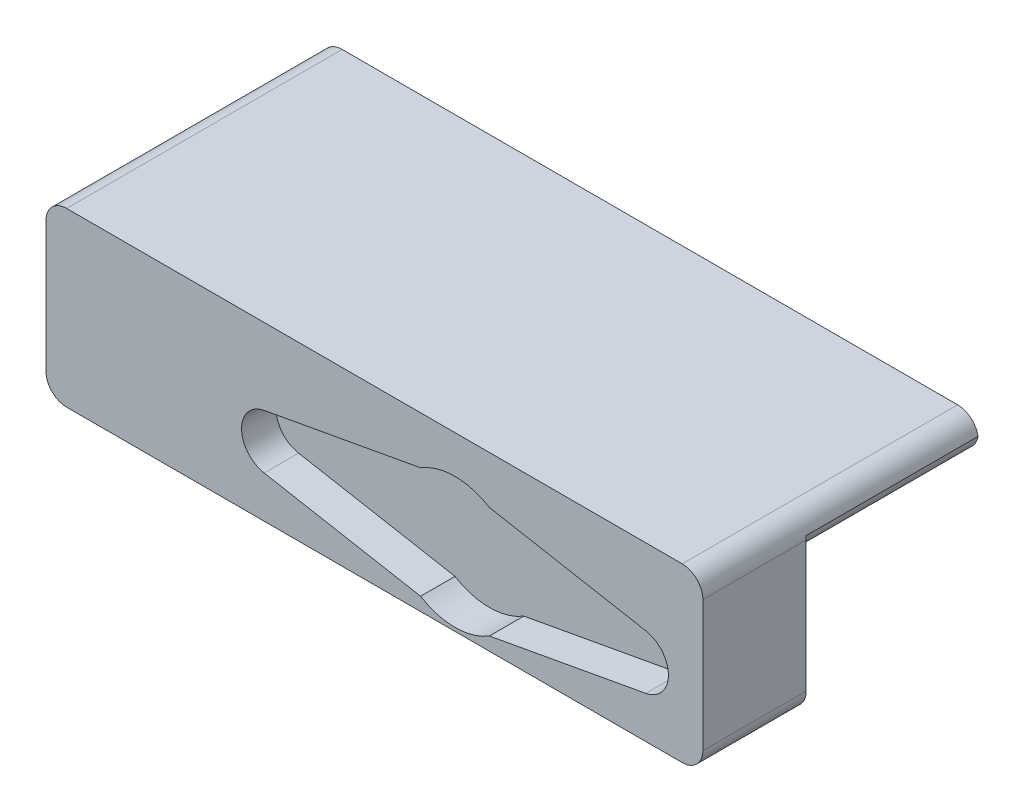
ISO-10303-21;
HEADER;
FILE_DESCRIPTION(('STEP AP214'),'2;1');
FILE_NAME('part.step','',(''),(''),'','','');
FILE_SCHEMA(('AUTOMOTIVE_DESIGN { 1 0 10303 214 1 1 1 1 }'));
ENDSEC;
DATA;
#1=APPLICATION_CONTEXT('core data for automotive mechanical design processes');
#2=APPLICATION_PROTOCOL_DEFINITION('international standard','automotive_design',2000,#1);
#3=PRODUCT_CONTEXT('',#1,'mechanical');
#4=PRODUCT('Part','Part','',(#3));
#5=PRODUCT_RELATED_PRODUCT_CATEGORY('part','',(#4));
#6=PRODUCT_DEFINITION_FORMATION('','',#4);
#7=PRODUCT_DEFINITION_CONTEXT('part definition',#1,'design');
#8=PRODUCT_DEFINITION('design','',#6,#7);
#9=PRODUCT_DEFINITION_SHAPE('','',#8);
#10=(LENGTH_UNIT() NAMED_UNIT(*) SI_UNIT(.MILLI.,.METRE.));
#11=(NAMED_UNIT(*) PLANE_ANGLE_UNIT() SI_UNIT($,.RADIAN.));
#12=(NAMED_UNIT(*) SI_UNIT($,.STERADIAN.) SOLID_ANGLE_UNIT());
#13=UNCERTAINTY_MEASURE_WITH_UNIT(LENGTH_MEASURE(1.E-05),#10,'distance_accuracy_value','');
#14=(GEOMETRIC_REPRESENTATION_CONTEXT(3) GLOBAL_UNCERTAINTY_ASSIGNED_CONTEXT((#13)) GLOBAL_UNIT_ASSIGNED_CONTEXT((#10,
#11,#12)) REPRESENTATION_CONTEXT('',''));
#15=CARTESIAN_POINT('',(0.,0.,0.));
#16=DIRECTION('',(0.,0.,1.));
#17=DIRECTION('',(1.,0.,0.));
#18=AXIS2_PLACEMENT_3D('',#15,#16,#17);
#19=CARTESIAN_POINT('',(-37.719,-6.35,6.35));
#20=DIRECTION('',(1.,0.,0.));
#21=DIRECTION('',(0.,0.,-1.));
#22=AXIS2_PLACEMENT_3D('',#19,#20,#21);
#23=PLANE('',#22);
#24=DIRECTION('',(0.,-1.,0.));
#25=VECTOR('',#24,1.);
#26=CARTESIAN_POINT('',(-37.719,-6.35,6.35));
#27=LINE('',#26,#25);
#28=CARTESIAN_POINT('',(-37.719,7.62,6.35));
#29=VERTEX_POINT('',#28);
#30=CARTESIAN_POINT('',(-37.719,-4.445,6.35));
#31=VERTEX_POINT('',#30);
#32=EDGE_CURVE('E253',#29,#31,#27,.T.);
#33=ORIENTED_EDGE('',*,*,#32,.F.);
#34=DIRECTION('',(0.,0.,1.));
#35=VECTOR('',#34,1.);
#36=CARTESIAN_POINT('',(-37.719,7.62,6.35));
#37=LINE('',#36,#35);
#38=CARTESIAN_POINT('',(-37.719,7.62,-19.05));
#39=VERTEX_POINT('',#38);
#40=EDGE_CURVE('E285',#29,#39,#37,.F.);
#41=ORIENTED_EDGE('',*,*,#40,.T.);
#42=DIRECTION('',(0.,1.,0.));
#43=VECTOR('',#42,1.);
#44=CARTESIAN_POINT('',(-37.719,-6.34999999999999,-19.05));
#45=LINE('',#44,#43);
#46=CARTESIAN_POINT('',(-37.719,-4.445,-19.05));
#47=VERTEX_POINT('',#46);
#48=EDGE_CURVE('E378',#47,#39,#45,.T.);
#49=ORIENTED_EDGE('',*,*,#48,.F.);
#50=DIRECTION('',(0.,0.,-1.));
#51=VECTOR('',#50,1.);
#52=CARTESIAN_POINT('',(-37.719,-4.445,6.35));
#53=LINE('',#52,#51);
#54=EDGE_CURVE('E283',#47,#31,#53,.F.);
#55=ORIENTED_EDGE('',*,*,#54,.T.);
#56=EDGE_LOOP('',(#33,#41,#49,#55));
#57=FACE_BOUND('',#56,.T.);
#58=ADVANCED_FACE('F38',(#57),#23,.F.);
#59=CARTESIAN_POINT('',(-37.719,-6.35,6.35));
#60=DIRECTION('',(0.,1.,0.));
#61=DIRECTION('',(0.,0.,1.));
#62=AXIS2_PLACEMENT_3D('',#59,#60,#61);
#63=PLANE('',#62);
#64=DIRECTION('',(1.,0.,0.));
#65=VECTOR('',#64,1.);
#66=CARTESIAN_POINT('',(-37.719,-6.35,6.35));
#67=LINE('',#66,#65);
#68=CARTESIAN_POINT('',(-35.814,-6.35,6.35));
#69=VERTEX_POINT('',#68);
#70=CARTESIAN_POINT('',(20.955,-6.35,6.35));
#71=VERTEX_POINT('',#70);
#72=EDGE_CURVE('E267',#69,#71,#67,.T.);
#73=ORIENTED_EDGE('',*,*,#72,.F.);
#74=DIRECTION('',(0.,0.,-1.));
#75=VECTOR('',#74,1.);
#76=CARTESIAN_POINT('',(-35.814,-6.35,6.35));
#77=LINE('',#76,#75);
#78=CARTESIAN_POINT('',(-35.814,-6.34999999999999,-3.175));
#79=VERTEX_POINT('',#78);
#80=EDGE_CURVE('E314',#69,#79,#77,.T.);
#81=ORIENTED_EDGE('',*,*,#80,.T.);
#82=DIRECTION('',(-1.,0.,0.));
#83=VECTOR('',#82,1.);
#84=CARTESIAN_POINT('',(-34.544,-6.34999999999999,-3.175));
#85=LINE('',#84,#83);
#86=CARTESIAN_POINT('',(20.955,-6.34999999999999,-3.175));
#87=VERTEX_POINT('',#86);
#88=EDGE_CURVE('E364',#87,#79,#85,.T.);
#89=ORIENTED_EDGE('',*,*,#88,.F.);
#90=DIRECTION('',(0.,0.,1.));
#91=VECTOR('',#90,1.);
#92=CARTESIAN_POINT('',(20.955,-6.35,6.35));
#93=LINE('',#92,#91);
#94=EDGE_CURVE('E311',#87,#71,#93,.T.);
#95=ORIENTED_EDGE('',*,*,#94,.T.);
#96=EDGE_LOOP('',(#73,#81,#89,#95));
#97=FACE_BOUND('',#96,.T.);
#98=ADVANCED_FACE('F362',(#97),#63,.F.);
#99=CARTESIAN_POINT('',(0.,0.,6.35));
#100=DIRECTION('',(0.,0.,-1.));
#101=DIRECTION('',(-1.,0.,0.));
#102=AXIS2_PLACEMENT_3D('',#99,#100,#101);
#103=PLANE('',#102);
#104=DIRECTION('',(-0.983777025667817,0.179395551138213,0.));
#105=VECTOR('',#104,1.);
#106=CARTESIAN_POINT('',(3.175,5.12936947879562,6.35));
#107=LINE('',#106,#105);
#108=CARTESIAN_POINT('',(17.6006646998911,2.49879364519626,6.35));
#109=VERTEX_POINT('',#108);
#110=CARTESIAN_POINT('',(3.175,5.12936947879562,6.35));
#111=VERTEX_POINT('',#110);
#112=EDGE_CURVE('E235',#109,#111,#107,.T.);
#113=ORIENTED_EDGE('',*,*,#112,.F.);
#114=CARTESIAN_POINT('',(17.145,0.,6.35));
#115=DIRECTION('',(0.,0.,1.));
#116=DIRECTION('',(1.,0.,0.));
#117=AXIS2_PLACEMENT_3D('',#114,#115,#116);
#118=CIRCLE('',#117,2.54);
#119=CARTESIAN_POINT('',(17.6006646998911,-2.49879364519626,6.35));
#120=VERTEX_POINT('',#119);
#121=EDGE_CURVE('E194',#120,#109,#118,.T.);
#122=ORIENTED_EDGE('',*,*,#121,.F.);
#123=DIRECTION('',(0.983777025667817,0.179395551138213,0.));
#124=VECTOR('',#123,1.);
#125=CARTESIAN_POINT('',(3.175,-5.12936947879562,6.35));
#126=LINE('',#125,#124);
#127=CARTESIAN_POINT('',(3.17499999999999,-5.12936947879561,6.35));
#128=VERTEX_POINT('',#127);
#129=EDGE_CURVE('E212',#128,#120,#126,.T.);
#130=ORIENTED_EDGE('',*,*,#129,.F.);
#131=CARTESIAN_POINT('',(0.,0.,6.35));
#132=DIRECTION('',(0.,0.,1.));
#133=DIRECTION('',(1.,0.,0.));
#134=AXIS2_PLACEMENT_3D('',#131,#132,#133);
#135=CIRCLE('',#134,6.03249999999999);
#136=CARTESIAN_POINT('',(-3.17499999999996,-5.12936947879562,6.35));
#137=VERTEX_POINT('',#136);
#138=EDGE_CURVE('E215',#137,#128,#135,.T.);
#139=ORIENTED_EDGE('',*,*,#138,.F.);
#140=DIRECTION('',(0.98377702566782,-0.179395551138198,0.));
#141=VECTOR('',#140,1.);
#142=CARTESIAN_POINT('',(-3.17499999999996,-5.12936947879562,6.35));
#143=LINE('',#142,#141);
#144=CARTESIAN_POINT('',(-17.6006646998911,-2.49879364519659,6.35));
#145=VERTEX_POINT('',#144);
#146=EDGE_CURVE('E246',#145,#137,#143,.T.);
#147=ORIENTED_EDGE('',*,*,#146,.F.);
#148=CARTESIAN_POINT('',(-17.145,-2.22044604925031E-13,6.35));
#149=DIRECTION('',(0.,0.,1.));
#150=DIRECTION('',(-1.,0.,0.));
#151=AXIS2_PLACEMENT_3D('',#148,#149,#150);
#152=CIRCLE('',#151,2.54000000000011);
#153=CARTESIAN_POINT('',(-17.6006646998911,2.49879364519626,6.35));
#154=VERTEX_POINT('',#153);
#155=EDGE_CURVE('E243',#154,#145,#152,.T.);
#156=ORIENTED_EDGE('',*,*,#155,.F.);
#157=DIRECTION('',(-0.983777025667817,-0.179395551138213,0.));
#158=VECTOR('',#157,1.);
#159=CARTESIAN_POINT('',(-3.17500000000003,5.12936947879562,6.35));
#160=LINE('',#159,#158);
#161=CARTESIAN_POINT('',(-3.17500000000003,5.12936947879561,6.35));
#162=VERTEX_POINT('',#161);
#163=EDGE_CURVE('E240',#162,#154,#160,.T.);
#164=ORIENTED_EDGE('',*,*,#163,.F.);
#165=CARTESIAN_POINT('',(0.,0.,6.35));
#166=DIRECTION('',(0.,0.,1.));
#167=DIRECTION('',(1.,0.,0.));
#168=AXIS2_PLACEMENT_3D('',#165,#166,#167);
#169=CIRCLE('',#168,6.03250000000001);
#170=EDGE_CURVE('E237',#111,#162,#169,.T.);
#171=ORIENTED_EDGE('',*,*,#170,.F.);
#172=EDGE_LOOP('',(#113,#122,#130,#139,#147,#156,#164,#171));
#173=FACE_BOUND('',#172,.T.);
#174=DIRECTION('',(1.,0.,0.));
#175=VECTOR('',#174,1.);
#176=CARTESIAN_POINT('',(-37.719,9.525,6.35));
#177=LINE('',#176,#175);
#178=CARTESIAN_POINT('',(-35.814,9.525,6.35));
#179=VERTEX_POINT('',#178);
#180=CARTESIAN_POINT('',(20.955,9.525,6.35));
#181=VERTEX_POINT('',#180);
#182=EDGE_CURVE('E354',#179,#181,#177,.T.);
#183=ORIENTED_EDGE('',*,*,#182,.F.);
#184=CARTESIAN_POINT('',(-35.814,7.62,6.35));
#185=DIRECTION('',(0.,0.,-1.));
#186=DIRECTION('',(-1.,0.,0.));
#187=AXIS2_PLACEMENT_3D('',#184,#185,#186);
#188=CIRCLE('',#187,1.905);
#189=EDGE_CURVE('E281',#179,#29,#188,.F.);
#190=ORIENTED_EDGE('',*,*,#189,.T.);
#191=ORIENTED_EDGE('',*,*,#32,.T.);
#192=CARTESIAN_POINT('',(-35.814,-4.445,6.35));
#193=DIRECTION('',(0.,0.,-1.));
#194=DIRECTION('',(-1.,0.,0.));
#195=AXIS2_PLACEMENT_3D('',#192,#193,#194);
#196=CIRCLE('',#195,1.905);
#197=EDGE_CURVE('E279',#31,#69,#196,.F.);
#198=ORIENTED_EDGE('',*,*,#197,.T.);
#199=ORIENTED_EDGE('',*,*,#72,.T.);
#200=CARTESIAN_POINT('',(20.955,-4.445,6.35));
#201=DIRECTION('',(0.,0.,-1.));
#202=DIRECTION('',(-1.,0.,0.));
#203=AXIS2_PLACEMENT_3D('',#200,#201,#202);
#204=CIRCLE('',#203,1.905);
#205=CARTESIAN_POINT('',(22.86,-4.445,6.35));
#206=VERTEX_POINT('',#205);
#207=EDGE_CURVE('E275',#71,#206,#204,.F.);
#208=ORIENTED_EDGE('',*,*,#207,.T.);
#209=DIRECTION('',(0.,-1.,0.));
#210=VECTOR('',#209,1.);
#211=CARTESIAN_POINT('',(22.86,-6.35,6.35));
#212=LINE('',#211,#210);
#213=CARTESIAN_POINT('',(22.86,7.62,6.35));
#214=VERTEX_POINT('',#213);
#215=EDGE_CURVE('E355',#214,#206,#212,.T.);
#216=ORIENTED_EDGE('',*,*,#215,.F.);
#217=CARTESIAN_POINT('',(20.955,7.62,6.35));
#218=DIRECTION('',(0.,0.,-1.));
#219=DIRECTION('',(-1.,0.,0.));
#220=AXIS2_PLACEMENT_3D('',#217,#218,#219);
#221=CIRCLE('',#220,1.905);
#222=EDGE_CURVE('E277',#214,#181,#221,.F.);
#223=ORIENTED_EDGE('',*,*,#222,.T.);
#224=EDGE_LOOP('',(#183,#190,#191,#198,#199,#208,#216,#223));
#225=FACE_BOUND('',#224,.T.);
#226=ADVANCED_FACE('F367',(#173,#225),#103,.F.);
#227=CARTESIAN_POINT('',(17.145,0.,3.175));
#228=DIRECTION('',(0.,0.,1.));
#229=DIRECTION('',(1.,0.,0.));
#230=AXIS2_PLACEMENT_3D('',#227,#228,#229);
#231=CYLINDRICAL_SURFACE('',#230,2.54);
#232=ORIENTED_EDGE('',*,*,#121,.T.);
#233=DIRECTION('',(0.,0.,1.));
#234=VECTOR('',#233,1.);
#235=CARTESIAN_POINT('',(17.6006646998911,2.49879364519626,3.175));
#236=LINE('',#235,#234);
#237=CARTESIAN_POINT('',(17.6006646998911,2.49879364519626,3.175));
#238=VERTEX_POINT('',#237);
#239=EDGE_CURVE('E187',#238,#109,#236,.T.);
#240=ORIENTED_EDGE('',*,*,#239,.F.);
#241=CARTESIAN_POINT('',(17.145,0.,3.175));
#242=DIRECTION('',(0.,0.,1.));
#243=DIRECTION('',(1.,0.,0.));
#244=AXIS2_PLACEMENT_3D('',#241,#242,#243);
#245=CIRCLE('',#244,2.54);
#246=CARTESIAN_POINT('',(17.6006646998911,-2.49879364519626,3.175));
#247=VERTEX_POINT('',#246);
#248=EDGE_CURVE('E191',#247,#238,#245,.T.);
#249=ORIENTED_EDGE('',*,*,#248,.F.);
#250=DIRECTION('',(0.,0.,1.));
#251=VECTOR('',#250,1.);
#252=CARTESIAN_POINT('',(17.6006646998911,-2.49879364519626,3.175));
#253=LINE('',#252,#251);
#254=EDGE_CURVE('E251',#247,#120,#253,.T.);
#255=ORIENTED_EDGE('',*,*,#254,.T.);
#256=EDGE_LOOP('',(#232,#240,#249,#255));
#257=FACE_BOUND('',#256,.T.);
#258=ADVANCED_FACE('F189',(#257),#231,.F.);
#259=CARTESIAN_POINT('',(3.175,-5.12936947879562,3.175));
#260=DIRECTION('',(0.179395551138213,-0.983777025667817,0.));
#261=DIRECTION('',(0.983777025667817,0.179395551138213,0.));
#262=AXIS2_PLACEMENT_3D('',#259,#260,#261);
#263=PLANE('',#262);
#264=ORIENTED_EDGE('',*,*,#129,.T.);
#265=ORIENTED_EDGE('',*,*,#254,.F.);
#266=DIRECTION('',(0.983777025667817,0.179395551138213,0.));
#267=VECTOR('',#266,1.);
#268=CARTESIAN_POINT('',(3.175,-5.12936947879562,3.175));
#269=LINE('',#268,#267);
#270=CARTESIAN_POINT('',(3.17499999999999,-5.12936947879561,3.175));
#271=VERTEX_POINT('',#270);
#272=EDGE_CURVE('E199',#271,#247,#269,.T.);
#273=ORIENTED_EDGE('',*,*,#272,.F.);
#274=DIRECTION('',(0.,0.,1.));
#275=VECTOR('',#274,1.);
#276=CARTESIAN_POINT('',(3.17499999999999,-5.12936947879561,3.175));
#277=LINE('',#276,#275);
#278=EDGE_CURVE('E254',#271,#128,#277,.T.);
#279=ORIENTED_EDGE('',*,*,#278,.T.);
#280=EDGE_LOOP('',(#264,#265,#273,#279));
#281=FACE_BOUND('',#280,.T.);
#282=ADVANCED_FACE('F454',(#281),#263,.F.);
#283=CARTESIAN_POINT('',(0.,0.,3.175));
#284=DIRECTION('',(0.,0.,1.));
#285=DIRECTION('',(1.,0.,0.));
#286=AXIS2_PLACEMENT_3D('',#283,#284,#285);
#287=CYLINDRICAL_SURFACE('',#286,6.03249999999999);
#288=ORIENTED_EDGE('',*,*,#138,.T.);
#289=ORIENTED_EDGE('',*,*,#278,.F.);
#290=CARTESIAN_POINT('',(0.,0.,3.175));
#291=DIRECTION('',(0.,0.,1.));
#292=DIRECTION('',(1.,0.,0.));
#293=AXIS2_PLACEMENT_3D('',#290,#291,#292);
#294=CIRCLE('',#293,6.03249999999999);
#295=CARTESIAN_POINT('',(-3.17499999999996,-5.12936947879562,3.175));
#296=VERTEX_POINT('',#295);
#297=EDGE_CURVE('E231',#296,#271,#294,.T.);
#298=ORIENTED_EDGE('',*,*,#297,.F.);
#299=DIRECTION('',(0.,0.,1.));
#300=VECTOR('',#299,1.);
#301=CARTESIAN_POINT('',(-3.17499999999996,-5.12936947879562,3.175));
#302=LINE('',#301,#300);
#303=EDGE_CURVE('E256',#296,#137,#302,.T.);
#304=ORIENTED_EDGE('',*,*,#303,.T.);
#305=EDGE_LOOP('',(#288,#289,#298,#304));
#306=FACE_BOUND('',#305,.T.);
#307=ADVANCED_FACE('F457',(#306),#287,.F.);
#308=CARTESIAN_POINT('',(-3.17499999999996,-5.12936947879562,3.175));
#309=DIRECTION('',(-0.179395551138198,-0.98377702566782,0.));
#310=DIRECTION('',(0.98377702566782,-0.179395551138198,0.));
#311=AXIS2_PLACEMENT_3D('',#308,#309,#310);
#312=PLANE('',#311);
#313=ORIENTED_EDGE('',*,*,#146,.T.);
#314=ORIENTED_EDGE('',*,*,#303,.F.);
#315=DIRECTION('',(0.98377702566782,-0.179395551138198,0.));
#316=VECTOR('',#315,1.);
#317=CARTESIAN_POINT('',(-3.17499999999996,-5.12936947879562,3.175));
#318=LINE('',#317,#316);
#319=CARTESIAN_POINT('',(-17.6006646998911,-2.49879364519659,3.175));
#320=VERTEX_POINT('',#319);
#321=EDGE_CURVE('E228',#320,#296,#318,.T.);
#322=ORIENTED_EDGE('',*,*,#321,.F.);
#323=DIRECTION('',(0.,0.,1.));
#324=VECTOR('',#323,1.);
#325=CARTESIAN_POINT('',(-17.6006646998911,-2.49879364519659,3.175));
#326=LINE('',#325,#324);
#327=EDGE_CURVE('E258',#320,#145,#326,.T.);
#328=ORIENTED_EDGE('',*,*,#327,.T.);
#329=EDGE_LOOP('',(#313,#314,#322,#328));
#330=FACE_BOUND('',#329,.T.);
#331=ADVANCED_FACE('F461',(#330),#312,.F.);
#332=CARTESIAN_POINT('',(-17.145,-2.22044604925031E-13,3.175));
#333=DIRECTION('',(0.,0.,1.));
#334=DIRECTION('',(1.,0.,0.));
#335=AXIS2_PLACEMENT_3D('',#332,#333,#334);
#336=CYLINDRICAL_SURFACE('',#335,2.54000000000011);
#337=ORIENTED_EDGE('',*,*,#155,.T.);
#338=ORIENTED_EDGE('',*,*,#327,.F.);
#339=CARTESIAN_POINT('',(-17.145,-2.22044604925031E-13,3.175));
#340=DIRECTION('',(0.,0.,1.));
#341=DIRECTION('',(-1.,0.,0.));
#342=AXIS2_PLACEMENT_3D('',#339,#340,#341);
#343=CIRCLE('',#342,2.54000000000011);
#344=CARTESIAN_POINT('',(-17.6006646998911,2.49879364519626,3.175));
#345=VERTEX_POINT('',#344);
#346=EDGE_CURVE('E225',#345,#320,#343,.T.);
#347=ORIENTED_EDGE('',*,*,#346,.F.);
#348=DIRECTION('',(0.,0.,1.));
#349=VECTOR('',#348,1.);
#350=CARTESIAN_POINT('',(-17.6006646998911,2.49879364519626,3.175));
#351=LINE('',#350,#349);
#352=EDGE_CURVE('E260',#345,#154,#351,.T.);
#353=ORIENTED_EDGE('',*,*,#352,.T.);
#354=EDGE_LOOP('',(#337,#338,#347,#353));
#355=FACE_BOUND('',#354,.T.);
#356=ADVANCED_FACE('F465',(#355),#336,.F.);
#357=CARTESIAN_POINT('',(-3.17500000000003,5.12936947879562,3.175));
#358=DIRECTION('',(-0.179395551138213,0.983777025667817,0.));
#359=DIRECTION('',(-0.983777025667817,-0.179395551138213,0.));
#360=AXIS2_PLACEMENT_3D('',#357,#358,#359);
#361=PLANE('',#360);
#362=ORIENTED_EDGE('',*,*,#163,.T.);
#363=ORIENTED_EDGE('',*,*,#352,.F.);
#364=DIRECTION('',(-0.983777025667817,-0.179395551138213,0.));
#365=VECTOR('',#364,1.);
#366=CARTESIAN_POINT('',(-3.17500000000003,5.12936947879562,3.175));
#367=LINE('',#366,#365);
#368=CARTESIAN_POINT('',(-3.17500000000003,5.12936947879561,3.175));
#369=VERTEX_POINT('',#368);
#370=EDGE_CURVE('E222',#369,#345,#367,.T.);
#371=ORIENTED_EDGE('',*,*,#370,.F.);
#372=DIRECTION('',(0.,0.,1.));
#373=VECTOR('',#372,1.);
#374=CARTESIAN_POINT('',(-3.17500000000003,5.12936947879561,3.175));
#375=LINE('',#374,#373);
#376=EDGE_CURVE('E262',#369,#162,#375,.T.);
#377=ORIENTED_EDGE('',*,*,#376,.T.);
#378=EDGE_LOOP('',(#362,#363,#371,#377));
#379=FACE_BOUND('',#378,.T.);
#380=ADVANCED_FACE('F469',(#379),#361,.F.);
#381=CARTESIAN_POINT('',(0.,0.,3.175));
#382=DIRECTION('',(0.,0.,1.));
#383=DIRECTION('',(1.,0.,0.));
#384=AXIS2_PLACEMENT_3D('',#381,#382,#383);
#385=CYLINDRICAL_SURFACE('',#384,6.03250000000001);
#386=ORIENTED_EDGE('',*,*,#170,.T.);
#387=ORIENTED_EDGE('',*,*,#376,.F.);
#388=CARTESIAN_POINT('',(0.,0.,3.175));
#389=DIRECTION('',(0.,0.,1.));
#390=DIRECTION('',(1.,0.,0.));
#391=AXIS2_PLACEMENT_3D('',#388,#389,#390);
#392=CIRCLE('',#391,6.03250000000001);
#393=CARTESIAN_POINT('',(3.175,5.12936947879562,3.175));
#394=VERTEX_POINT('',#393);
#395=EDGE_CURVE('E207',#394,#369,#392,.T.);
#396=ORIENTED_EDGE('',*,*,#395,.F.);
#397=DIRECTION('',(0.,0.,1.));
#398=VECTOR('',#397,1.);
#399=CARTESIAN_POINT('',(3.175,5.12936947879562,3.175));
#400=LINE('',#399,#398);
#401=EDGE_CURVE('E198',#394,#111,#400,.T.);
#402=ORIENTED_EDGE('',*,*,#401,.T.);
#403=EDGE_LOOP('',(#386,#387,#396,#402));
#404=FACE_BOUND('',#403,.T.);
#405=ADVANCED_FACE('F473',(#404),#385,.F.);
#406=CARTESIAN_POINT('',(3.175,5.12936947879562,3.175));
#407=DIRECTION('',(0.179395551138213,0.983777025667817,0.));
#408=DIRECTION('',(-0.983777025667817,0.179395551138213,0.));
#409=AXIS2_PLACEMENT_3D('',#406,#407,#408);
#410=PLANE('',#409);
#411=ORIENTED_EDGE('',*,*,#112,.T.);
#412=ORIENTED_EDGE('',*,*,#401,.F.);
#413=DIRECTION('',(-0.983777025667817,0.179395551138213,0.));
#414=VECTOR('',#413,1.);
#415=CARTESIAN_POINT('',(3.175,5.12936947879562,3.175));
#416=LINE('',#415,#414);
#417=EDGE_CURVE('E202',#238,#394,#416,.T.);
#418=ORIENTED_EDGE('',*,*,#417,.F.);
#419=ORIENTED_EDGE('',*,*,#239,.T.);
#420=EDGE_LOOP('',(#411,#412,#418,#419));
#421=FACE_BOUND('',#420,.T.);
#422=ADVANCED_FACE('F203',(#421),#410,.F.);
#423=CARTESIAN_POINT('',(17.145,0.,3.175));
#424=DIRECTION('',(0.,0.,1.));
#425=DIRECTION('',(1.,0.,0.));
#426=AXIS2_PLACEMENT_3D('',#423,#424,#425);
#427=PLANE('',#426);
#428=ORIENTED_EDGE('',*,*,#248,.T.);
#429=ORIENTED_EDGE('',*,*,#417,.T.);
#430=ORIENTED_EDGE('',*,*,#395,.T.);
#431=ORIENTED_EDGE('',*,*,#370,.T.);
#432=ORIENTED_EDGE('',*,*,#346,.T.);
#433=ORIENTED_EDGE('',*,*,#321,.T.);
#434=ORIENTED_EDGE('',*,*,#297,.T.);
#435=ORIENTED_EDGE('',*,*,#272,.T.);
#436=EDGE_LOOP('',(#428,#429,#430,#431,#432,#433,#434,#435));
#437=FACE_BOUND('',#436,.T.);
#438=ADVANCED_FACE('F209',(#437),#427,.T.);
#439=CARTESIAN_POINT('',(-34.544,84.1561330744563,-3.175));
#440=DIRECTION('',(1.,0.,0.));
#441=DIRECTION('',(0.,0.,-1.));
#442=AXIS2_PLACEMENT_3D('',#439,#440,#441);
#443=PLANE('',#442);
#444=DIRECTION('',(0.,-1.,0.));
#445=VECTOR('',#444,1.);
#446=CARTESIAN_POINT('',(-34.544,6.35,-19.05));
#447=LINE('',#446,#445);
#448=CARTESIAN_POINT('',(-34.544,4.445,-19.05));
#449=VERTEX_POINT('',#448);
#450=CARTESIAN_POINT('',(-34.544,-4.445,-19.05));
#451=VERTEX_POINT('',#450);
#452=EDGE_CURVE('E333',#449,#451,#447,.T.);
#453=ORIENTED_EDGE('',*,*,#452,.F.);
#454=DIRECTION('',(0.,0.,-1.));
#455=VECTOR('',#454,1.);
#456=CARTESIAN_POINT('',(-34.544,4.445,-3.175));
#457=LINE('',#456,#455);
#458=CARTESIAN_POINT('',(-34.544,4.44500000000003,-3.175));
#459=VERTEX_POINT('',#458);
#460=EDGE_CURVE('E305',#449,#459,#457,.F.);
#461=ORIENTED_EDGE('',*,*,#460,.T.);
#462=DIRECTION('',(0.,-1.,0.));
#463=VECTOR('',#462,1.);
#464=CARTESIAN_POINT('',(-34.544,84.1561330744563,-3.175));
#465=LINE('',#464,#463);
#466=CARTESIAN_POINT('',(-34.544,-4.445,-3.175));
#467=VERTEX_POINT('',#466);
#468=EDGE_CURVE('E391',#459,#467,#465,.T.);
#469=ORIENTED_EDGE('',*,*,#468,.T.);
#470=DIRECTION('',(0.,0.,-1.));
#471=VECTOR('',#470,1.);
#472=CARTESIAN_POINT('',(-34.544,-4.445,-19.05));
#473=LINE('',#472,#471);
#474=EDGE_CURVE('E303',#467,#451,#473,.T.);
#475=ORIENTED_EDGE('',*,*,#474,.T.);
#476=EDGE_LOOP('',(#453,#461,#469,#475));
#477=FACE_BOUND('',#476,.T.);
#478=ADVANCED_FACE('F407',(#477),#443,.T.);
#479=CARTESIAN_POINT('',(-34.544,84.1561330744563,-3.175));
#480=DIRECTION('',(0.,0.,-1.));
#481=DIRECTION('',(-1.,0.,0.));
#482=AXIS2_PLACEMENT_3D('',#479,#480,#481);
#483=PLANE('',#482);
#484=ORIENTED_EDGE('',*,*,#468,.F.);
#485=CARTESIAN_POINT('',(-32.639,4.445,-3.175));
#486=DIRECTION('',(0.,0.,-1.));
#487=DIRECTION('',(-1.,0.,0.));
#488=AXIS2_PLACEMENT_3D('',#485,#486,#487);
#489=CIRCLE('',#488,1.905);
#490=CARTESIAN_POINT('',(-32.639,6.34999999999999,-3.175));
#491=VERTEX_POINT('',#490);
#492=EDGE_CURVE('E309',#459,#491,#489,.T.);
#493=ORIENTED_EDGE('',*,*,#492,.T.);
#494=DIRECTION('',(-1.,0.,0.));
#495=VECTOR('',#494,1.);
#496=CARTESIAN_POINT('',(-34.544,6.34999999999999,-3.175));
#497=LINE('',#496,#495);
#498=CARTESIAN_POINT('',(20.955,6.34999999999999,-3.175));
#499=VERTEX_POINT('',#498);
#500=EDGE_CURVE('E218',#499,#491,#497,.T.);
#501=ORIENTED_EDGE('',*,*,#500,.F.);
#502=CARTESIAN_POINT('',(20.955,8.255,-3.175));
#503=DIRECTION('',(0.,0.,-1.));
#504=DIRECTION('',(-1.,0.,0.));
#505=AXIS2_PLACEMENT_3D('',#502,#503,#504);
#506=CIRCLE('',#505,1.905);
#507=CARTESIAN_POINT('',(22.8333553311341,7.9375,-3.175));
#508=VERTEX_POINT('',#507);
#509=EDGE_CURVE('E47',#499,#508,#506,.F.);
#510=ORIENTED_EDGE('',*,*,#509,.T.);
#511=CARTESIAN_POINT('',(20.955,7.62,-3.175));
#512=DIRECTION('',(0.,0.,-1.));
#513=DIRECTION('',(-1.,0.,0.));
#514=AXIS2_PLACEMENT_3D('',#511,#512,#513);
#515=CIRCLE('',#514,1.905);
#516=CARTESIAN_POINT('',(22.86,7.62,-3.175));
#517=VERTEX_POINT('',#516);
#518=EDGE_CURVE('E11',#508,#517,#515,.T.);
#519=ORIENTED_EDGE('',*,*,#518,.T.);
#520=DIRECTION('',(0.,1.,0.));
#521=VECTOR('',#520,1.);
#522=CARTESIAN_POINT('',(22.86,84.1561330744563,-3.175));
#523=LINE('',#522,#521);
#524=CARTESIAN_POINT('',(22.86,-4.445,-3.175));
#525=VERTEX_POINT('',#524);
#526=EDGE_CURVE('E350',#525,#517,#523,.T.);
#527=ORIENTED_EDGE('',*,*,#526,.F.);
#528=CARTESIAN_POINT('',(20.955,-4.445,-3.175));
#529=DIRECTION('',(0.,0.,-1.));
#530=DIRECTION('',(-1.,0.,0.));
#531=AXIS2_PLACEMENT_3D('',#528,#529,#530);
#532=CIRCLE('',#531,1.905);
#533=EDGE_CURVE('E307',#525,#87,#532,.T.);
#534=ORIENTED_EDGE('',*,*,#533,.T.);
#535=ORIENTED_EDGE('',*,*,#88,.T.);
#536=CARTESIAN_POINT('',(-35.814,-4.445,-3.175));
#537=DIRECTION('',(0.,0.,-1.));
#538=DIRECTION('',(-1.,0.,0.));
#539=AXIS2_PLACEMENT_3D('',#536,#537,#538);
#540=CIRCLE('',#539,1.905);
#541=CARTESIAN_POINT('',(-36.1315,-6.32335533113413,-3.175));
#542=VERTEX_POINT('',#541);
#543=EDGE_CURVE('E60',#79,#542,#540,.T.);
#544=ORIENTED_EDGE('',*,*,#543,.T.);
#545=CARTESIAN_POINT('',(-36.449,-4.445,-3.175));
#546=DIRECTION('',(0.,0.,-1.));
#547=DIRECTION('',(-1.,0.,0.));
#548=AXIS2_PLACEMENT_3D('',#545,#546,#547);
#549=CIRCLE('',#548,1.905);
#550=EDGE_CURVE('E324',#542,#467,#549,.F.);
#551=ORIENTED_EDGE('',*,*,#550,.T.);
#552=EDGE_LOOP('',(#484,#493,#501,#510,#519,#527,#534,#535,#544,#551));
#553=FACE_BOUND('',#552,.T.);
#554=ADVANCED_FACE('F349',(#553),#483,.T.);
#555=CARTESIAN_POINT('',(0.,6.35,0.));
#556=DIRECTION('',(0.,-1.,0.));
#557=DIRECTION('',(0.,0.,-1.));
#558=AXIS2_PLACEMENT_3D('',#555,#556,#557);
#559=PLANE('',#558);
#560=ORIENTED_EDGE('',*,*,#500,.T.);
#561=DIRECTION('',(0.,0.,-1.));
#562=VECTOR('',#561,1.);
#563=CARTESIAN_POINT('',(-32.639,6.35,-19.05));
#564=LINE('',#563,#562);
#565=CARTESIAN_POINT('',(-32.639,6.35,-19.05));
#566=VERTEX_POINT('',#565);
#567=EDGE_CURVE('E300',#491,#566,#564,.T.);
#568=ORIENTED_EDGE('',*,*,#567,.T.);
#569=DIRECTION('',(-1.,0.,0.));
#570=VECTOR('',#569,1.);
#571=CARTESIAN_POINT('',(22.86,6.35,-19.05));
#572=LINE('',#571,#570);
#573=CARTESIAN_POINT('',(20.955,6.35,-19.05));
#574=VERTEX_POINT('',#573);
#575=EDGE_CURVE('E328',#574,#566,#572,.T.);
#576=ORIENTED_EDGE('',*,*,#575,.F.);
#577=DIRECTION('',(0.,0.,-1.));
#578=VECTOR('',#577,1.);
#579=CARTESIAN_POINT('',(20.955,6.35,-3.175));
#580=LINE('',#579,#578);
#581=EDGE_CURVE('E297',#574,#499,#580,.F.);
#582=ORIENTED_EDGE('',*,*,#581,.T.);
#583=EDGE_LOOP('',(#560,#568,#576,#582));
#584=FACE_BOUND('',#583,.T.);
#585=ADVANCED_FACE('F398',(#584),#559,.T.);
#586=CARTESIAN_POINT('',(0.,9.525,0.));
#587=DIRECTION('',(0.,-1.,0.));
#588=DIRECTION('',(0.,0.,-1.));
#589=AXIS2_PLACEMENT_3D('',#586,#587,#588);
#590=PLANE('',#589);
#591=DIRECTION('',(1.,0.,0.));
#592=VECTOR('',#591,1.);
#593=CARTESIAN_POINT('',(-37.719,9.52500000000001,-19.05));
#594=LINE('',#593,#592);
#595=CARTESIAN_POINT('',(-35.814,9.52500000000001,-19.05));
#596=VERTEX_POINT('',#595);
#597=CARTESIAN_POINT('',(20.955,9.525,-19.05));
#598=VERTEX_POINT('',#597);
#599=EDGE_CURVE('E381',#596,#598,#594,.T.);
#600=ORIENTED_EDGE('',*,*,#599,.F.);
#601=DIRECTION('',(0.,0.,1.));
#602=VECTOR('',#601,1.);
#603=CARTESIAN_POINT('',(-35.814,9.525,0.));
#604=LINE('',#603,#602);
#605=EDGE_CURVE('E272',#596,#179,#604,.T.);
#606=ORIENTED_EDGE('',*,*,#605,.T.);
#607=ORIENTED_EDGE('',*,*,#182,.T.);
#608=DIRECTION('',(0.,0.,1.));
#609=VECTOR('',#608,1.);
#610=CARTESIAN_POINT('',(20.955,9.525,0.));
#611=LINE('',#610,#609);
#612=EDGE_CURVE('E270',#181,#598,#611,.F.);
#613=ORIENTED_EDGE('',*,*,#612,.T.);
#614=EDGE_LOOP('',(#600,#606,#607,#613));
#615=FACE_BOUND('',#614,.T.);
#616=ADVANCED_FACE('F439',(#615),#590,.F.);
#617=CARTESIAN_POINT('',(22.86,-6.35,-19.05));
#618=DIRECTION('',(-1.,0.,0.));
#619=DIRECTION('',(0.,-1.,0.));
#620=AXIS2_PLACEMENT_3D('',#617,#618,#619);
#621=PLANE('',#620);
#622=ORIENTED_EDGE('',*,*,#526,.T.);
#623=DIRECTION('',(0.,0.,1.));
#624=VECTOR('',#623,1.);
#625=CARTESIAN_POINT('',(22.86,7.62,-19.05));
#626=LINE('',#625,#624);
#627=EDGE_CURVE('E319',#517,#214,#626,.T.);
#628=ORIENTED_EDGE('',*,*,#627,.T.);
#629=ORIENTED_EDGE('',*,*,#215,.T.);
#630=DIRECTION('',(0.,0.,1.));
#631=VECTOR('',#630,1.);
#632=CARTESIAN_POINT('',(22.86,-4.445,-19.05));
#633=LINE('',#632,#631);
#634=EDGE_CURVE('E317',#206,#525,#633,.F.);
#635=ORIENTED_EDGE('',*,*,#634,.T.);
#636=EDGE_LOOP('',(#622,#628,#629,#635));
#637=FACE_BOUND('',#636,.T.);
#638=ADVANCED_FACE('F434',(#637),#621,.F.);
#639=CARTESIAN_POINT('',(0.,0.,-19.05));
#640=DIRECTION('',(0.,0.,1.));
#641=DIRECTION('',(1.,0.,0.));
#642=AXIS2_PLACEMENT_3D('',#639,#640,#641);
#643=PLANE('',#642);
#644=ORIENTED_EDGE('',*,*,#48,.T.);
#645=CARTESIAN_POINT('',(-35.814,7.62,-19.05));
#646=DIRECTION('',(0.,0.,1.));
#647=DIRECTION('',(1.,0.,0.));
#648=AXIS2_PLACEMENT_3D('',#645,#646,#647);
#649=CIRCLE('',#648,1.905);
#650=EDGE_CURVE('E295',#39,#596,#649,.F.);
#651=ORIENTED_EDGE('',*,*,#650,.T.);
#652=ORIENTED_EDGE('',*,*,#599,.T.);
#653=CARTESIAN_POINT('',(20.955,7.62,-19.05));
#654=DIRECTION('',(0.,0.,1.));
#655=DIRECTION('',(1.,0.,0.));
#656=AXIS2_PLACEMENT_3D('',#653,#654,#655);
#657=CIRCLE('',#656,1.905);
#658=CARTESIAN_POINT('',(22.8333553311341,7.9375,-19.05));
#659=VERTEX_POINT('',#658);
#660=EDGE_CURVE('E287',#598,#659,#657,.F.);
#661=ORIENTED_EDGE('',*,*,#660,.T.);
#662=CARTESIAN_POINT('',(20.955,8.255,-19.05));
#663=DIRECTION('',(0.,0.,1.));
#664=DIRECTION('',(1.,0.,0.));
#665=AXIS2_PLACEMENT_3D('',#662,#663,#664);
#666=CIRCLE('',#665,1.905);
#667=EDGE_CURVE('E289',#659,#574,#666,.F.);
#668=ORIENTED_EDGE('',*,*,#667,.T.);
#669=ORIENTED_EDGE('',*,*,#575,.T.);
#670=CARTESIAN_POINT('',(-32.639,4.445,-19.05));
#671=DIRECTION('',(0.,0.,1.));
#672=DIRECTION('',(1.,0.,0.));
#673=AXIS2_PLACEMENT_3D('',#670,#671,#672);
#674=CIRCLE('',#673,1.905);
#675=EDGE_CURVE('E321',#566,#449,#674,.T.);
#676=ORIENTED_EDGE('',*,*,#675,.T.);
#677=ORIENTED_EDGE('',*,*,#452,.T.);
#678=CARTESIAN_POINT('',(-36.449,-4.445,-19.05));
#679=DIRECTION('',(0.,0.,1.));
#680=DIRECTION('',(1.,0.,0.));
#681=AXIS2_PLACEMENT_3D('',#678,#679,#680);
#682=CIRCLE('',#681,1.905);
#683=CARTESIAN_POINT('',(-36.1315,-6.32335533113413,-19.05));
#684=VERTEX_POINT('',#683);
#685=EDGE_CURVE('E291',#451,#684,#682,.F.);
#686=ORIENTED_EDGE('',*,*,#685,.T.);
#687=CARTESIAN_POINT('',(-35.814,-4.445,-19.05));
#688=DIRECTION('',(0.,0.,1.));
#689=DIRECTION('',(1.,0.,0.));
#690=AXIS2_PLACEMENT_3D('',#687,#688,#689);
#691=CIRCLE('',#690,1.905);
#692=EDGE_CURVE('E293',#684,#47,#691,.F.);
#693=ORIENTED_EDGE('',*,*,#692,.T.);
#694=EDGE_LOOP('',(#644,#651,#652,#661,#668,#669,#676,#677,#686,#693));
#695=FACE_BOUND('',#694,.T.);
#696=ADVANCED_FACE('F405',(#695),#643,.F.);
#697=CARTESIAN_POINT('',(-35.814,7.62,0.));
#698=DIRECTION('',(0.,0.,1.));
#699=DIRECTION('',(1.,0.,0.));
#700=AXIS2_PLACEMENT_3D('',#697,#698,#699);
#701=CYLINDRICAL_SURFACE('',#700,1.905);
#702=ORIENTED_EDGE('',*,*,#650,.F.);
#703=ORIENTED_EDGE('',*,*,#40,.F.);
#704=ORIENTED_EDGE('',*,*,#189,.F.);
#705=ORIENTED_EDGE('',*,*,#605,.F.);
#706=EDGE_LOOP('',(#702,#703,#704,#705));
#707=FACE_BOUND('',#706,.T.);
#708=ADVANCED_FACE('F417',(#707),#701,.T.);
#709=CARTESIAN_POINT('',(-32.639,4.445,0.));
#710=DIRECTION('',(0.,0.,1.));
#711=DIRECTION('',(1.,0.,0.));
#712=AXIS2_PLACEMENT_3D('',#709,#710,#711);
#713=CYLINDRICAL_SURFACE('',#712,1.905);
#714=ORIENTED_EDGE('',*,*,#492,.F.);
#715=ORIENTED_EDGE('',*,*,#460,.F.);
#716=ORIENTED_EDGE('',*,*,#675,.F.);
#717=ORIENTED_EDGE('',*,*,#567,.F.);
#718=EDGE_LOOP('',(#714,#715,#716,#717));
#719=FACE_BOUND('',#718,.T.);
#720=ADVANCED_FACE('F402',(#719),#713,.F.);
#721=CARTESIAN_POINT('',(-36.449,-4.445,-3.175));
#722=DIRECTION('',(0.,0.,1.));
#723=DIRECTION('',(1.,0.,0.));
#724=AXIS2_PLACEMENT_3D('',#721,#722,#723);
#725=CYLINDRICAL_SURFACE('',#724,1.905);
#726=ORIENTED_EDGE('',*,*,#474,.F.);
#727=ORIENTED_EDGE('',*,*,#550,.F.);
#728=DIRECTION('',(0.,0.,1.));
#729=VECTOR('',#728,1.);
#730=CARTESIAN_POINT('',(-36.1315,-6.32335533113413,-11.1125));
#731=LINE('',#730,#729);
#732=EDGE_CURVE('E326',#684,#542,#731,.T.);
#733=ORIENTED_EDGE('',*,*,#732,.F.);
#734=ORIENTED_EDGE('',*,*,#685,.F.);
#735=EDGE_LOOP('',(#726,#727,#733,#734));
#736=FACE_BOUND('',#735,.T.);
#737=ADVANCED_FACE('F409',(#736),#725,.T.);
#738=CARTESIAN_POINT('',(-35.814,-4.445,6.35));
#739=DIRECTION('',(0.,0.,-1.));
#740=DIRECTION('',(-1.,0.,0.));
#741=AXIS2_PLACEMENT_3D('',#738,#739,#740);
#742=CYLINDRICAL_SURFACE('',#741,1.905);
#743=ORIENTED_EDGE('',*,*,#197,.F.);
#744=ORIENTED_EDGE('',*,*,#54,.F.);
#745=ORIENTED_EDGE('',*,*,#692,.F.);
#746=ORIENTED_EDGE('',*,*,#732,.T.);
#747=ORIENTED_EDGE('',*,*,#543,.F.);
#748=ORIENTED_EDGE('',*,*,#80,.F.);
#749=EDGE_LOOP('',(#743,#744,#745,#746,#747,#748));
#750=FACE_BOUND('',#749,.T.);
#751=ADVANCED_FACE('F373',(#750),#742,.T.);
#752=CARTESIAN_POINT('',(20.955,7.62,-19.05));
#753=DIRECTION('',(0.,0.,1.));
#754=DIRECTION('',(1.,0.,0.));
#755=AXIS2_PLACEMENT_3D('',#752,#753,#754);
#756=CYLINDRICAL_SURFACE('',#755,1.905);
#757=ORIENTED_EDGE('',*,*,#627,.F.);
#758=ORIENTED_EDGE('',*,*,#518,.F.);
#759=DIRECTION('',(0.,0.,1.));
#760=VECTOR('',#759,1.);
#761=CARTESIAN_POINT('',(22.8333553311341,7.9375,-19.05));
#762=LINE('',#761,#760);
#763=EDGE_CURVE('E42',#659,#508,#762,.T.);
#764=ORIENTED_EDGE('',*,*,#763,.F.);
#765=ORIENTED_EDGE('',*,*,#660,.F.);
#766=ORIENTED_EDGE('',*,*,#612,.F.);
#767=ORIENTED_EDGE('',*,*,#222,.F.);
#768=EDGE_LOOP('',(#757,#758,#764,#765,#766,#767));
#769=FACE_BOUND('',#768,.T.);
#770=ADVANCED_FACE('F344',(#769),#756,.T.);
#771=CARTESIAN_POINT('',(20.955,8.255,-19.05));
#772=DIRECTION('',(0.,0.,1.));
#773=DIRECTION('',(1.,0.,0.));
#774=AXIS2_PLACEMENT_3D('',#771,#772,#773);
#775=CYLINDRICAL_SURFACE('',#774,1.905);
#776=ORIENTED_EDGE('',*,*,#509,.F.);
#777=ORIENTED_EDGE('',*,*,#581,.F.);
#778=ORIENTED_EDGE('',*,*,#667,.F.);
#779=ORIENTED_EDGE('',*,*,#763,.T.);
#780=EDGE_LOOP('',(#776,#777,#778,#779));
#781=FACE_BOUND('',#780,.T.);
#782=ADVANCED_FACE('F339',(#781),#775,.T.);
#783=CARTESIAN_POINT('',(20.955,-4.445,6.35));
#784=DIRECTION('',(0.,0.,1.));
#785=DIRECTION('',(1.,0.,0.));
#786=AXIS2_PLACEMENT_3D('',#783,#784,#785);
#787=CYLINDRICAL_SURFACE('',#786,1.905);
#788=ORIENTED_EDGE('',*,*,#533,.F.);
#789=ORIENTED_EDGE('',*,*,#634,.F.);
#790=ORIENTED_EDGE('',*,*,#207,.F.);
#791=ORIENTED_EDGE('',*,*,#94,.F.);
#792=EDGE_LOOP('',(#788,#789,#790,#791));
#793=FACE_BOUND('',#792,.T.);
#794=ADVANCED_FACE('F40',(#793),#787,.T.);
#795=CLOSED_SHELL('',(#58,#98,#226,#258,#282,#307,#331,#356,#380,#405,#422,#438,#478,#554,#585,
#616,#638,#696,#708,#720,#737,#751,#770,#782,#794));
#796=MANIFOLD_SOLID_BREP('B2',#795);
#797=ADVANCED_BREP_SHAPE_REPRESENTATION('',(#18,#796),#14);
#798=SHAPE_DEFINITION_REPRESENTATION(#9,#797);
ENDSEC;
END-ISO-10303-21;
